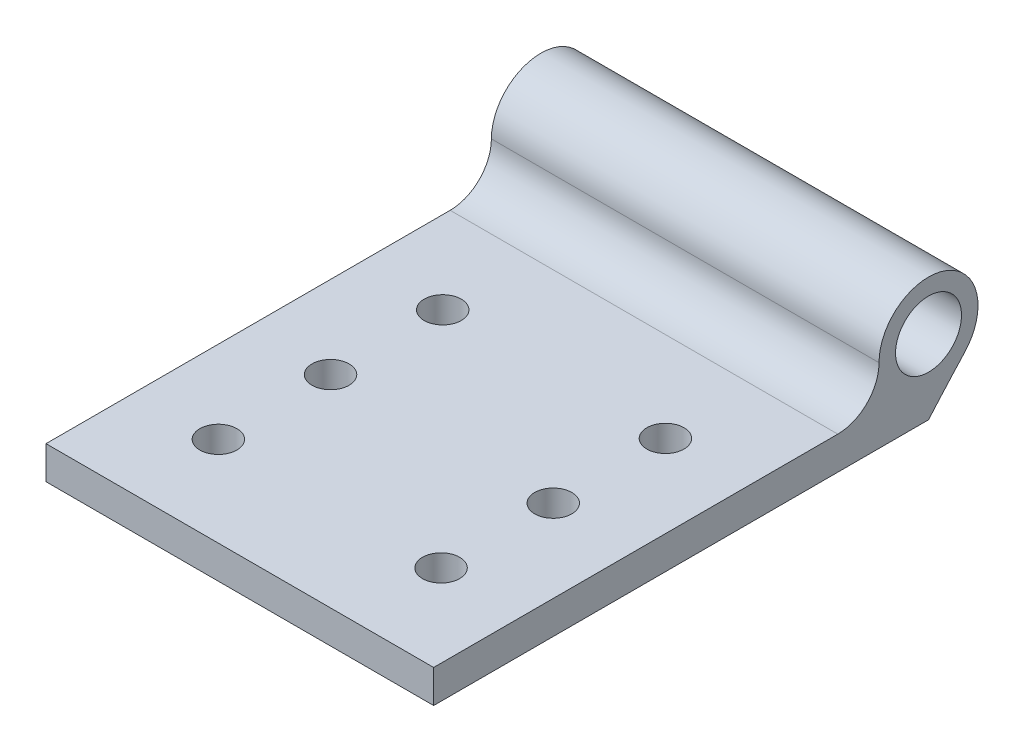
ISO-10303-21;
HEADER;
FILE_DESCRIPTION(('STEP AP214'),'2;1');
FILE_NAME('part.step','',(''),(''),'','','');
FILE_SCHEMA(('AUTOMOTIVE_DESIGN { 1 0 10303 214 1 1 1 1 }'));
ENDSEC;
DATA;
#1=APPLICATION_CONTEXT('core data for automotive mechanical design processes');
#2=APPLICATION_PROTOCOL_DEFINITION('international standard','automotive_design',2000,#1);
#3=PRODUCT_CONTEXT('',#1,'mechanical');
#4=PRODUCT('Part','Part','',(#3));
#5=PRODUCT_RELATED_PRODUCT_CATEGORY('part','',(#4));
#6=PRODUCT_DEFINITION_FORMATION('','',#4);
#7=PRODUCT_DEFINITION_CONTEXT('part definition',#1,'design');
#8=PRODUCT_DEFINITION('design','',#6,#7);
#9=PRODUCT_DEFINITION_SHAPE('','',#8);
#10=(LENGTH_UNIT() NAMED_UNIT(*) SI_UNIT(.MILLI.,.METRE.));
#11=(NAMED_UNIT(*) PLANE_ANGLE_UNIT() SI_UNIT($,.RADIAN.));
#12=(NAMED_UNIT(*) SI_UNIT($,.STERADIAN.) SOLID_ANGLE_UNIT());
#13=UNCERTAINTY_MEASURE_WITH_UNIT(LENGTH_MEASURE(1.E-05),#10,'distance_accuracy_value','');
#14=(GEOMETRIC_REPRESENTATION_CONTEXT(3) GLOBAL_UNCERTAINTY_ASSIGNED_CONTEXT((#13)) GLOBAL_UNIT_ASSIGNED_CONTEXT((#10,
#11,#12)) REPRESENTATION_CONTEXT('',''));
#15=CARTESIAN_POINT('',(0.,0.,0.));
#16=DIRECTION('',(0.,0.,1.));
#17=DIRECTION('',(1.,0.,0.));
#18=AXIS2_PLACEMENT_3D('',#15,#16,#17);
#19=CARTESIAN_POINT('',(-11.75,2.,30.));
#20=DIRECTION('',(1.,0.,0.));
#21=DIRECTION('',(0.,0.,-1.));
#22=AXIS2_PLACEMENT_3D('',#19,#20,#21);
#23=PLANE('',#22);
#24=DIRECTION('',(0.,0.,-1.));
#25=VECTOR('',#24,1.);
#26=CARTESIAN_POINT('',(-11.75,2.,30.));
#27=LINE('',#26,#25);
#28=CARTESIAN_POINT('',(-11.75,2.,30.));
#29=VERTEX_POINT('',#28);
#30=CARTESIAN_POINT('',(-11.75,2.,5.5));
#31=VERTEX_POINT('',#30);
#32=EDGE_CURVE('E126',#29,#31,#27,.T.);
#33=ORIENTED_EDGE('',*,*,#32,.T.);
#34=CARTESIAN_POINT('',(-11.75,4.5,5.5));
#35=DIRECTION('',(1.,0.,0.));
#36=DIRECTION('',(0.,0.,-1.));
#37=AXIS2_PLACEMENT_3D('',#34,#35,#36);
#38=CIRCLE('',#37,2.5);
#39=CARTESIAN_POINT('',(-11.75,4.5,3.));
#40=VERTEX_POINT('',#39);
#41=EDGE_CURVE('E40',#31,#40,#38,.T.);
#42=ORIENTED_EDGE('',*,*,#41,.T.);
#43=CARTESIAN_POINT('',(-11.75,4.50000000000001,0.));
#44=DIRECTION('',(1.,0.,0.));
#45=DIRECTION('',(0.,1.,0.));
#46=AXIS2_PLACEMENT_3D('',#43,#44,#45);
#47=CIRCLE('',#46,3.);
#48=CARTESIAN_POINT('',(-11.75,2.46681415929205,-2.20593638556162));
#49=VERTEX_POINT('',#48);
#50=EDGE_CURVE('E133',#49,#40,#47,.T.);
#51=ORIENTED_EDGE('',*,*,#50,.F.);
#52=CARTESIAN_POINT('',(-11.75,-72.0833333333333,-83.0902705228209));
#53=DIRECTION('',(1.,0.,0.));
#54=DIRECTION('',(0.,0.,-1.));
#55=AXIS2_PLACEMENT_3D('',#52,#53,#54);
#56=CIRCLE('',#55,110.);
#57=CARTESIAN_POINT('',(-11.75,0.,0.));
#58=VERTEX_POINT('',#57);
#59=EDGE_CURVE('E108',#49,#58,#56,.T.);
#60=ORIENTED_EDGE('',*,*,#59,.T.);
#61=DIRECTION('',(0.,0.,-1.));
#62=VECTOR('',#61,1.);
#63=CARTESIAN_POINT('',(-11.75,0.,30.));
#64=LINE('',#63,#62);
#65=CARTESIAN_POINT('',(-11.75,0.,30.));
#66=VERTEX_POINT('',#65);
#67=EDGE_CURVE('E90',#66,#58,#64,.T.);
#68=ORIENTED_EDGE('',*,*,#67,.F.);
#69=DIRECTION('',(0.,-1.,0.));
#70=VECTOR('',#69,1.);
#71=CARTESIAN_POINT('',(-11.75,2.,30.));
#72=LINE('',#71,#70);
#73=EDGE_CURVE('E97',#29,#66,#72,.T.);
#74=ORIENTED_EDGE('',*,*,#73,.F.);
#75=EDGE_LOOP('',(#33,#42,#51,#60,#68,#74));
#76=FACE_BOUND('',#75,.T.);
#77=CARTESIAN_POINT('',(-11.75,4.50000000000001,0.));
#78=DIRECTION('',(1.,0.,0.));
#79=DIRECTION('',(0.,1.,0.));
#80=AXIS2_PLACEMENT_3D('',#77,#78,#79);
#81=CIRCLE('',#80,2.);
#82=CARTESIAN_POINT('',(-11.75,6.50000000000001,0.));
#83=VERTEX_POINT('',#82);
#84=EDGE_CURVE('E138',#83,#83,#81,.T.);
#85=ORIENTED_EDGE('',*,*,#84,.T.);
#86=EDGE_LOOP('',(#85));
#87=FACE_BOUND('',#86,.T.);
#88=ADVANCED_FACE('F32',(#76,#87),#23,.F.);
#89=CARTESIAN_POINT('',(-11.75,0.,30.));
#90=DIRECTION('',(0.,1.,0.));
#91=DIRECTION('',(0.,0.,1.));
#92=AXIS2_PLACEMENT_3D('',#89,#90,#91);
#93=PLANE('',#92);
#94=CARTESIAN_POINT('',(6.75,0.,10.95));
#95=DIRECTION('',(0.,1.,0.));
#96=DIRECTION('',(0.,0.,1.));
#97=AXIS2_PLACEMENT_3D('',#94,#95,#96);
#98=CIRCLE('',#97,1.125);
#99=CARTESIAN_POINT('',(6.75,0.,12.075));
#100=VERTEX_POINT('',#99);
#101=EDGE_CURVE('E143',#100,#100,#98,.T.);
#102=ORIENTED_EDGE('',*,*,#101,.T.);
#103=EDGE_LOOP('',(#102));
#104=FACE_BOUND('',#103,.T.);
#105=CARTESIAN_POINT('',(6.75,0.,17.75));
#106=DIRECTION('',(0.,1.,0.));
#107=DIRECTION('',(0.,0.,1.));
#108=AXIS2_PLACEMENT_3D('',#105,#106,#107);
#109=CIRCLE('',#108,1.125);
#110=CARTESIAN_POINT('',(6.75,0.,18.875));
#111=VERTEX_POINT('',#110);
#112=EDGE_CURVE('E148',#111,#111,#109,.T.);
#113=ORIENTED_EDGE('',*,*,#112,.T.);
#114=EDGE_LOOP('',(#113));
#115=FACE_BOUND('',#114,.T.);
#116=CARTESIAN_POINT('',(6.75,0.,24.55));
#117=DIRECTION('',(0.,1.,0.));
#118=DIRECTION('',(0.,0.,1.));
#119=AXIS2_PLACEMENT_3D('',#116,#117,#118);
#120=CIRCLE('',#119,1.125);
#121=CARTESIAN_POINT('',(6.75,0.,25.675));
#122=VERTEX_POINT('',#121);
#123=EDGE_CURVE('E151',#122,#122,#120,.T.);
#124=ORIENTED_EDGE('',*,*,#123,.T.);
#125=EDGE_LOOP('',(#124));
#126=FACE_BOUND('',#125,.T.);
#127=CARTESIAN_POINT('',(-6.75,0.,24.55));
#128=DIRECTION('',(0.,1.,0.));
#129=DIRECTION('',(0.,0.,1.));
#130=AXIS2_PLACEMENT_3D('',#127,#128,#129);
#131=CIRCLE('',#130,1.125);
#132=CARTESIAN_POINT('',(-6.75,0.,25.675));
#133=VERTEX_POINT('',#132);
#134=EDGE_CURVE('E154',#133,#133,#131,.T.);
#135=ORIENTED_EDGE('',*,*,#134,.T.);
#136=EDGE_LOOP('',(#135));
#137=FACE_BOUND('',#136,.T.);
#138=CARTESIAN_POINT('',(-6.75,0.,17.75));
#139=DIRECTION('',(0.,1.,0.));
#140=DIRECTION('',(0.,0.,1.));
#141=AXIS2_PLACEMENT_3D('',#138,#139,#140);
#142=CIRCLE('',#141,1.125);
#143=CARTESIAN_POINT('',(-6.75,0.,18.875));
#144=VERTEX_POINT('',#143);
#145=EDGE_CURVE('E157',#144,#144,#142,.T.);
#146=ORIENTED_EDGE('',*,*,#145,.T.);
#147=EDGE_LOOP('',(#146));
#148=FACE_BOUND('',#147,.T.);
#149=CARTESIAN_POINT('',(-6.75,0.,10.95));
#150=DIRECTION('',(0.,1.,0.));
#151=DIRECTION('',(0.,0.,1.));
#152=AXIS2_PLACEMENT_3D('',#149,#150,#151);
#153=CIRCLE('',#152,1.125);
#154=CARTESIAN_POINT('',(-6.75,0.,12.075));
#155=VERTEX_POINT('',#154);
#156=EDGE_CURVE('E160',#155,#155,#153,.T.);
#157=ORIENTED_EDGE('',*,*,#156,.T.);
#158=EDGE_LOOP('',(#157));
#159=FACE_BOUND('',#158,.T.);
#160=DIRECTION('',(1.,0.,0.));
#161=VECTOR('',#160,1.);
#162=CARTESIAN_POINT('',(-11.75,0.,0.));
#163=LINE('',#162,#161);
#164=CARTESIAN_POINT('',(11.75,0.,0.));
#165=VERTEX_POINT('',#164);
#166=EDGE_CURVE('E104',#58,#165,#163,.T.);
#167=ORIENTED_EDGE('',*,*,#166,.T.);
#168=DIRECTION('',(0.,0.,-1.));
#169=VECTOR('',#168,1.);
#170=CARTESIAN_POINT('',(11.75,0.,30.));
#171=LINE('',#170,#169);
#172=CARTESIAN_POINT('',(11.75,0.,30.));
#173=VERTEX_POINT('',#172);
#174=EDGE_CURVE('E93',#173,#165,#171,.T.);
#175=ORIENTED_EDGE('',*,*,#174,.F.);
#176=DIRECTION('',(1.,0.,0.));
#177=VECTOR('',#176,1.);
#178=CARTESIAN_POINT('',(-11.75,0.,30.));
#179=LINE('',#178,#177);
#180=EDGE_CURVE('E85',#66,#173,#179,.T.);
#181=ORIENTED_EDGE('',*,*,#180,.F.);
#182=ORIENTED_EDGE('',*,*,#67,.T.);
#183=EDGE_LOOP('',(#167,#175,#181,#182));
#184=FACE_BOUND('',#183,.T.);
#185=ADVANCED_FACE('F88',(#104,#115,#126,#137,#148,#159,#184),#93,.F.);
#186=CARTESIAN_POINT('',(11.75,2.,30.));
#187=DIRECTION('',(-1.,0.,0.));
#188=DIRECTION('',(0.,0.,1.));
#189=AXIS2_PLACEMENT_3D('',#186,#187,#188);
#190=PLANE('',#189);
#191=ORIENTED_EDGE('',*,*,#174,.T.);
#192=CARTESIAN_POINT('',(11.75,-72.0833333333333,-83.0902705228209));
#193=DIRECTION('',(-1.,0.,0.));
#194=DIRECTION('',(0.,0.,1.));
#195=AXIS2_PLACEMENT_3D('',#192,#193,#194);
#196=CIRCLE('',#195,110.);
#197=CARTESIAN_POINT('',(11.75,2.46681415929204,-2.20593638556162));
#198=VERTEX_POINT('',#197);
#199=EDGE_CURVE('E111',#165,#198,#196,.T.);
#200=ORIENTED_EDGE('',*,*,#199,.T.);
#201=CARTESIAN_POINT('',(11.75,4.5,0.));
#202=DIRECTION('',(1.,0.,0.));
#203=DIRECTION('',(0.,1.,0.));
#204=AXIS2_PLACEMENT_3D('',#201,#202,#203);
#205=CIRCLE('',#204,3.);
#206=CARTESIAN_POINT('',(11.75,4.5,3.));
#207=VERTEX_POINT('',#206);
#208=EDGE_CURVE('E136',#198,#207,#205,.T.);
#209=ORIENTED_EDGE('',*,*,#208,.T.);
#210=CARTESIAN_POINT('',(11.75,4.49999999999998,5.5));
#211=DIRECTION('',(-1.,0.,0.));
#212=DIRECTION('',(0.,0.,1.));
#213=AXIS2_PLACEMENT_3D('',#210,#211,#212);
#214=CIRCLE('',#213,2.5);
#215=CARTESIAN_POINT('',(11.75,2.,5.5));
#216=VERTEX_POINT('',#215);
#217=EDGE_CURVE('E11',#207,#216,#214,.T.);
#218=ORIENTED_EDGE('',*,*,#217,.T.);
#219=DIRECTION('',(0.,0.,-1.));
#220=VECTOR('',#219,1.);
#221=CARTESIAN_POINT('',(11.75,2.,30.));
#222=LINE('',#221,#220);
#223=CARTESIAN_POINT('',(11.75,2.,30.));
#224=VERTEX_POINT('',#223);
#225=EDGE_CURVE('E113',#224,#216,#222,.T.);
#226=ORIENTED_EDGE('',*,*,#225,.F.);
#227=DIRECTION('',(0.,1.,0.));
#228=VECTOR('',#227,1.);
#229=CARTESIAN_POINT('',(11.75,2.,30.));
#230=LINE('',#229,#228);
#231=EDGE_CURVE('E96',#173,#224,#230,.T.);
#232=ORIENTED_EDGE('',*,*,#231,.F.);
#233=EDGE_LOOP('',(#191,#200,#209,#218,#226,#232));
#234=FACE_BOUND('',#233,.T.);
#235=CARTESIAN_POINT('',(11.75,4.5,0.));
#236=DIRECTION('',(1.,0.,0.));
#237=DIRECTION('',(0.,1.,0.));
#238=AXIS2_PLACEMENT_3D('',#235,#236,#237);
#239=CIRCLE('',#238,2.);
#240=CARTESIAN_POINT('',(11.75,6.5,0.));
#241=VERTEX_POINT('',#240);
#242=EDGE_CURVE('E140',#241,#241,#239,.T.);
#243=ORIENTED_EDGE('',*,*,#242,.F.);
#244=EDGE_LOOP('',(#243));
#245=FACE_BOUND('',#244,.T.);
#246=ADVANCED_FACE('F187',(#234,#245),#190,.F.);
#247=CARTESIAN_POINT('',(-11.75,2.,30.));
#248=DIRECTION('',(0.,-1.,0.));
#249=DIRECTION('',(1.,0.,0.));
#250=AXIS2_PLACEMENT_3D('',#247,#248,#249);
#251=PLANE('',#250);
#252=CARTESIAN_POINT('',(6.75,2.,10.95));
#253=DIRECTION('',(0.,1.,0.));
#254=DIRECTION('',(-1.,0.,0.));
#255=AXIS2_PLACEMENT_3D('',#252,#253,#254);
#256=CIRCLE('',#255,1.125);
#257=CARTESIAN_POINT('',(5.625,2.,10.95));
#258=VERTEX_POINT('',#257);
#259=EDGE_CURVE('E167',#258,#258,#256,.T.);
#260=ORIENTED_EDGE('',*,*,#259,.F.);
#261=EDGE_LOOP('',(#260));
#262=FACE_BOUND('',#261,.T.);
#263=CARTESIAN_POINT('',(6.75,2.,17.75));
#264=DIRECTION('',(0.,1.,0.));
#265=DIRECTION('',(-1.,0.,0.));
#266=AXIS2_PLACEMENT_3D('',#263,#264,#265);
#267=CIRCLE('',#266,1.125);
#268=CARTESIAN_POINT('',(5.625,2.,17.75));
#269=VERTEX_POINT('',#268);
#270=EDGE_CURVE('E170',#269,#269,#267,.T.);
#271=ORIENTED_EDGE('',*,*,#270,.F.);
#272=EDGE_LOOP('',(#271));
#273=FACE_BOUND('',#272,.T.);
#274=CARTESIAN_POINT('',(6.75,2.,24.55));
#275=DIRECTION('',(0.,1.,0.));
#276=DIRECTION('',(-1.,0.,0.));
#277=AXIS2_PLACEMENT_3D('',#274,#275,#276);
#278=CIRCLE('',#277,1.125);
#279=CARTESIAN_POINT('',(5.625,2.,24.55));
#280=VERTEX_POINT('',#279);
#281=EDGE_CURVE('E173',#280,#280,#278,.T.);
#282=ORIENTED_EDGE('',*,*,#281,.F.);
#283=EDGE_LOOP('',(#282));
#284=FACE_BOUND('',#283,.T.);
#285=CARTESIAN_POINT('',(-6.75,2.,24.55));
#286=DIRECTION('',(0.,1.,0.));
#287=DIRECTION('',(-1.,0.,0.));
#288=AXIS2_PLACEMENT_3D('',#285,#286,#287);
#289=CIRCLE('',#288,1.125);
#290=CARTESIAN_POINT('',(-7.875,2.,24.55));
#291=VERTEX_POINT('',#290);
#292=EDGE_CURVE('E176',#291,#291,#289,.T.);
#293=ORIENTED_EDGE('',*,*,#292,.F.);
#294=EDGE_LOOP('',(#293));
#295=FACE_BOUND('',#294,.T.);
#296=CARTESIAN_POINT('',(-6.75,2.,17.75));
#297=DIRECTION('',(0.,1.,0.));
#298=DIRECTION('',(-1.,0.,0.));
#299=AXIS2_PLACEMENT_3D('',#296,#297,#298);
#300=CIRCLE('',#299,1.125);
#301=CARTESIAN_POINT('',(-7.875,2.,17.75));
#302=VERTEX_POINT('',#301);
#303=EDGE_CURVE('E166',#302,#302,#300,.T.);
#304=ORIENTED_EDGE('',*,*,#303,.F.);
#305=EDGE_LOOP('',(#304));
#306=FACE_BOUND('',#305,.T.);
#307=CARTESIAN_POINT('',(-6.75,2.,10.95));
#308=DIRECTION('',(0.,1.,0.));
#309=DIRECTION('',(-1.,0.,0.));
#310=AXIS2_PLACEMENT_3D('',#307,#308,#309);
#311=CIRCLE('',#310,1.125);
#312=CARTESIAN_POINT('',(-7.875,2.,10.95));
#313=VERTEX_POINT('',#312);
#314=EDGE_CURVE('E163',#313,#313,#311,.T.);
#315=ORIENTED_EDGE('',*,*,#314,.F.);
#316=EDGE_LOOP('',(#315));
#317=FACE_BOUND('',#316,.T.);
#318=ORIENTED_EDGE('',*,*,#225,.T.);
#319=DIRECTION('',(1.,0.,0.));
#320=VECTOR('',#319,1.);
#321=CARTESIAN_POINT('',(-11.75,2.,5.5));
#322=LINE('',#321,#320);
#323=EDGE_CURVE('E119',#216,#31,#322,.F.);
#324=ORIENTED_EDGE('',*,*,#323,.T.);
#325=ORIENTED_EDGE('',*,*,#32,.F.);
#326=DIRECTION('',(-1.,0.,0.));
#327=VECTOR('',#326,1.);
#328=CARTESIAN_POINT('',(-11.75,2.,30.));
#329=LINE('',#328,#327);
#330=EDGE_CURVE('E102',#224,#29,#329,.T.);
#331=ORIENTED_EDGE('',*,*,#330,.F.);
#332=EDGE_LOOP('',(#318,#324,#325,#331));
#333=FACE_BOUND('',#332,.T.);
#334=ADVANCED_FACE('F125',(#262,#273,#284,#295,#306,#317,#333),#251,.F.);
#335=CARTESIAN_POINT('',(0.,0.,30.));
#336=DIRECTION('',(0.,0.,1.));
#337=DIRECTION('',(1.,0.,0.));
#338=AXIS2_PLACEMENT_3D('',#335,#336,#337);
#339=PLANE('',#338);
#340=ORIENTED_EDGE('',*,*,#73,.T.);
#341=ORIENTED_EDGE('',*,*,#180,.T.);
#342=ORIENTED_EDGE('',*,*,#231,.T.);
#343=ORIENTED_EDGE('',*,*,#330,.T.);
#344=EDGE_LOOP('',(#340,#341,#342,#343));
#345=FACE_BOUND('',#344,.T.);
#346=ADVANCED_FACE('F100',(#345),#339,.T.);
#347=CARTESIAN_POINT('',(-11.75,4.50000000000001,0.));
#348=DIRECTION('',(1.,0.,0.));
#349=DIRECTION('',(0.,1.,0.));
#350=AXIS2_PLACEMENT_3D('',#347,#348,#349);
#351=CYLINDRICAL_SURFACE('',#350,3.);
#352=ORIENTED_EDGE('',*,*,#50,.T.);
#353=DIRECTION('',(1.,0.,0.));
#354=VECTOR('',#353,1.);
#355=CARTESIAN_POINT('',(-11.75,4.5,3.));
#356=LINE('',#355,#354);
#357=EDGE_CURVE('E53',#40,#207,#356,.T.);
#358=ORIENTED_EDGE('',*,*,#357,.T.);
#359=ORIENTED_EDGE('',*,*,#208,.F.);
#360=DIRECTION('',(1.,0.,0.));
#361=VECTOR('',#360,1.);
#362=CARTESIAN_POINT('',(-11.75,2.46681415929205,-2.20593638556162));
#363=LINE('',#362,#361);
#364=EDGE_CURVE('E109',#198,#49,#363,.F.);
#365=ORIENTED_EDGE('',*,*,#364,.T.);
#366=EDGE_LOOP('',(#352,#358,#359,#365));
#367=FACE_BOUND('',#366,.T.);
#368=ADVANCED_FACE('F217',(#367),#351,.T.);
#369=CARTESIAN_POINT('',(-11.75,4.50000000000001,0.));
#370=DIRECTION('',(1.,0.,0.));
#371=DIRECTION('',(0.,1.,0.));
#372=AXIS2_PLACEMENT_3D('',#369,#370,#371);
#373=CYLINDRICAL_SURFACE('',#372,2.);
#374=ORIENTED_EDGE('',*,*,#84,.F.);
#375=EDGE_LOOP('',(#374));
#376=FACE_BOUND('',#375,.T.);
#377=ORIENTED_EDGE('',*,*,#242,.T.);
#378=EDGE_LOOP('',(#377));
#379=FACE_BOUND('',#378,.T.);
#380=ADVANCED_FACE('F211',(#376,#379),#373,.F.);
#381=CARTESIAN_POINT('',(-11.7500000000001,-72.0833333333333,-83.0902705228209));
#382=DIRECTION('',(-1.,0.,0.));
#383=DIRECTION('',(0.,0.,1.));
#384=AXIS2_PLACEMENT_3D('',#381,#382,#383);
#385=CYLINDRICAL_SURFACE('',#384,110.);
#386=ORIENTED_EDGE('',*,*,#59,.F.);
#387=ORIENTED_EDGE('',*,*,#364,.F.);
#388=ORIENTED_EDGE('',*,*,#199,.F.);
#389=ORIENTED_EDGE('',*,*,#166,.F.);
#390=EDGE_LOOP('',(#386,#387,#388,#389));
#391=FACE_BOUND('',#390,.T.);
#392=ADVANCED_FACE('F209',(#391),#385,.F.);
#393=CARTESIAN_POINT('',(-11.75,4.5,5.5));
#394=DIRECTION('',(1.,0.,0.));
#395=DIRECTION('',(0.,1.,0.));
#396=AXIS2_PLACEMENT_3D('',#393,#394,#395);
#397=CYLINDRICAL_SURFACE('',#396,2.5);
#398=ORIENTED_EDGE('',*,*,#217,.F.);
#399=ORIENTED_EDGE('',*,*,#357,.F.);
#400=ORIENTED_EDGE('',*,*,#41,.F.);
#401=ORIENTED_EDGE('',*,*,#323,.F.);
#402=EDGE_LOOP('',(#398,#399,#400,#401));
#403=FACE_BOUND('',#402,.T.);
#404=ADVANCED_FACE('F34',(#403),#397,.F.);
#405=CARTESIAN_POINT('',(-6.75,-22.,10.95));
#406=DIRECTION('',(0.,1.,0.));
#407=DIRECTION('',(-1.,0.,0.));
#408=AXIS2_PLACEMENT_3D('',#405,#406,#407);
#409=CYLINDRICAL_SURFACE('',#408,1.125);
#410=ORIENTED_EDGE('',*,*,#314,.T.);
#411=EDGE_LOOP('',(#410));
#412=FACE_BOUND('',#411,.T.);
#413=ORIENTED_EDGE('',*,*,#156,.F.);
#414=EDGE_LOOP('',(#413));
#415=FACE_BOUND('',#414,.T.);
#416=ADVANCED_FACE('F192',(#412,#415),#409,.F.);
#417=CARTESIAN_POINT('',(-6.75,-22.,17.75));
#418=DIRECTION('',(0.,1.,0.));
#419=DIRECTION('',(-1.,0.,0.));
#420=AXIS2_PLACEMENT_3D('',#417,#418,#419);
#421=CYLINDRICAL_SURFACE('',#420,1.125);
#422=ORIENTED_EDGE('',*,*,#303,.T.);
#423=EDGE_LOOP('',(#422));
#424=FACE_BOUND('',#423,.T.);
#425=ORIENTED_EDGE('',*,*,#145,.F.);
#426=EDGE_LOOP('',(#425));
#427=FACE_BOUND('',#426,.T.);
#428=ADVANCED_FACE('F182',(#424,#427),#421,.F.);
#429=CARTESIAN_POINT('',(-6.75,-22.,24.55));
#430=DIRECTION('',(0.,1.,0.));
#431=DIRECTION('',(-1.,0.,0.));
#432=AXIS2_PLACEMENT_3D('',#429,#430,#431);
#433=CYLINDRICAL_SURFACE('',#432,1.125);
#434=ORIENTED_EDGE('',*,*,#292,.T.);
#435=EDGE_LOOP('',(#434));
#436=FACE_BOUND('',#435,.T.);
#437=ORIENTED_EDGE('',*,*,#134,.F.);
#438=EDGE_LOOP('',(#437));
#439=FACE_BOUND('',#438,.T.);
#440=ADVANCED_FACE('F240',(#436,#439),#433,.F.);
#441=CARTESIAN_POINT('',(6.75,-22.,24.55));
#442=DIRECTION('',(0.,1.,0.));
#443=DIRECTION('',(-1.,0.,0.));
#444=AXIS2_PLACEMENT_3D('',#441,#442,#443);
#445=CYLINDRICAL_SURFACE('',#444,1.125);
#446=ORIENTED_EDGE('',*,*,#281,.T.);
#447=EDGE_LOOP('',(#446));
#448=FACE_BOUND('',#447,.T.);
#449=ORIENTED_EDGE('',*,*,#123,.F.);
#450=EDGE_LOOP('',(#449));
#451=FACE_BOUND('',#450,.T.);
#452=ADVANCED_FACE('F236',(#448,#451),#445,.F.);
#453=CARTESIAN_POINT('',(6.75,-22.,17.75));
#454=DIRECTION('',(0.,1.,0.));
#455=DIRECTION('',(-1.,0.,0.));
#456=AXIS2_PLACEMENT_3D('',#453,#454,#455);
#457=CYLINDRICAL_SURFACE('',#456,1.125);
#458=ORIENTED_EDGE('',*,*,#270,.T.);
#459=EDGE_LOOP('',(#458));
#460=FACE_BOUND('',#459,.T.);
#461=ORIENTED_EDGE('',*,*,#112,.F.);
#462=EDGE_LOOP('',(#461));
#463=FACE_BOUND('',#462,.T.);
#464=ADVANCED_FACE('F232',(#460,#463),#457,.F.);
#465=CARTESIAN_POINT('',(6.75,-22.,10.95));
#466=DIRECTION('',(0.,1.,0.));
#467=DIRECTION('',(-1.,0.,0.));
#468=AXIS2_PLACEMENT_3D('',#465,#466,#467);
#469=CYLINDRICAL_SURFACE('',#468,1.125);
#470=ORIENTED_EDGE('',*,*,#259,.T.);
#471=EDGE_LOOP('',(#470));
#472=FACE_BOUND('',#471,.T.);
#473=ORIENTED_EDGE('',*,*,#101,.F.);
#474=EDGE_LOOP('',(#473));
#475=FACE_BOUND('',#474,.T.);
#476=ADVANCED_FACE('F229',(#472,#475),#469,.F.);
#477=CLOSED_SHELL('',(#88,#185,#246,#334,#346,#368,#380,#392,#404,#416,#428,#440,#452,#464,#476));
#478=MANIFOLD_SOLID_BREP('B2',#477);
#479=ADVANCED_BREP_SHAPE_REPRESENTATION('',(#18,#478),#14);
#480=SHAPE_DEFINITION_REPRESENTATION(#9,#479);
ENDSEC;
END-ISO-10303-21;
